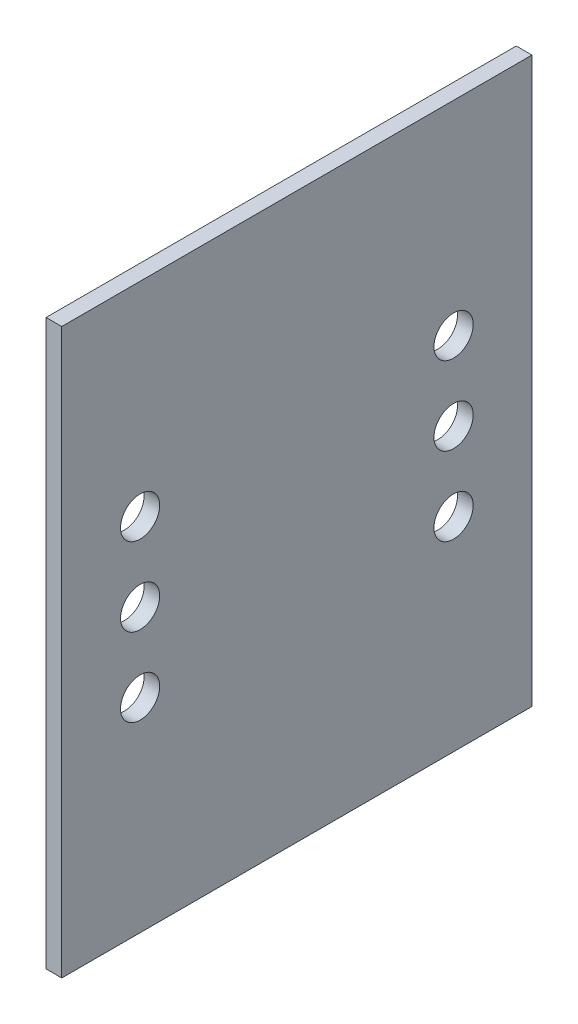
ISO-10303-21;
HEADER;
FILE_DESCRIPTION(('STEP AP214'),'2;1');
FILE_NAME('part.step','',(''),(''),'','','');
FILE_SCHEMA(('AUTOMOTIVE_DESIGN { 1 0 10303 214 1 1 1 1 }'));
ENDSEC;
DATA;
#1=APPLICATION_CONTEXT('core data for automotive mechanical design processes');
#2=APPLICATION_PROTOCOL_DEFINITION('international standard','automotive_design',2000,#1);
#3=PRODUCT_CONTEXT('',#1,'mechanical');
#4=PRODUCT('Part','Part','',(#3));
#5=PRODUCT_RELATED_PRODUCT_CATEGORY('part','',(#4));
#6=PRODUCT_DEFINITION_FORMATION('','',#4);
#7=PRODUCT_DEFINITION_CONTEXT('part definition',#1,'design');
#8=PRODUCT_DEFINITION('design','',#6,#7);
#9=PRODUCT_DEFINITION_SHAPE('','',#8);
#10=(LENGTH_UNIT() NAMED_UNIT(*) SI_UNIT(.MILLI.,.METRE.));
#11=(NAMED_UNIT(*) PLANE_ANGLE_UNIT() SI_UNIT($,.RADIAN.));
#12=(NAMED_UNIT(*) SI_UNIT($,.STERADIAN.) SOLID_ANGLE_UNIT());
#13=UNCERTAINTY_MEASURE_WITH_UNIT(LENGTH_MEASURE(1.E-05),#10,'distance_accuracy_value','');
#14=(GEOMETRIC_REPRESENTATION_CONTEXT(3) GLOBAL_UNCERTAINTY_ASSIGNED_CONTEXT((#13)) GLOBAL_UNIT_ASSIGNED_CONTEXT((#10,
#11,#12)) REPRESENTATION_CONTEXT('',''));
#15=CARTESIAN_POINT('',(0.,0.,0.));
#16=DIRECTION('',(0.,0.,1.));
#17=DIRECTION('',(1.,0.,0.));
#18=AXIS2_PLACEMENT_3D('',#15,#16,#17);
#19=CARTESIAN_POINT('',(160.,2387.5,30.));
#20=DIRECTION('',(1.,0.,0.));
#21=DIRECTION('',(0.,0.,-1.));
#22=AXIS2_PLACEMENT_3D('',#19,#20,#21);
#23=PLANE('',#22);
#24=DIRECTION('',(0.,1.,0.));
#25=VECTOR('',#24,1.);
#26=CARTESIAN_POINT('',(160.,2347.5,-150.));
#27=LINE('',#26,#25);
#28=CARTESIAN_POINT('',(160.,2347.5,-150.));
#29=VERTEX_POINT('',#28);
#30=CARTESIAN_POINT('',(160.,2707.5,-150.));
#31=VERTEX_POINT('',#30);
#32=EDGE_CURVE('E83',#29,#31,#27,.T.);
#33=ORIENTED_EDGE('',*,*,#32,.T.);
#34=DIRECTION('',(0.,0.,1.));
#35=VECTOR('',#34,1.);
#36=CARTESIAN_POINT('',(160.,2707.5,150.));
#37=LINE('',#36,#35);
#38=CARTESIAN_POINT('',(160.,2707.5,150.));
#39=VERTEX_POINT('',#38);
#40=EDGE_CURVE('E87',#31,#39,#37,.T.);
#41=ORIENTED_EDGE('',*,*,#40,.T.);
#42=DIRECTION('',(0.,-1.,0.));
#43=VECTOR('',#42,1.);
#44=CARTESIAN_POINT('',(160.,2347.5,150.));
#45=LINE('',#44,#43);
#46=CARTESIAN_POINT('',(160.,2347.5,150.));
#47=VERTEX_POINT('',#46);
#48=EDGE_CURVE('E77',#39,#47,#45,.T.);
#49=ORIENTED_EDGE('',*,*,#48,.T.);
#50=DIRECTION('',(0.,0.,-1.));
#51=VECTOR('',#50,1.);
#52=CARTESIAN_POINT('',(160.,2347.5,150.));
#53=LINE('',#52,#51);
#54=EDGE_CURVE('E38',#47,#29,#53,.T.);
#55=ORIENTED_EDGE('',*,*,#54,.T.);
#56=EDGE_LOOP('',(#33,#41,#49,#55));
#57=FACE_BOUND('',#56,.T.);
#58=CARTESIAN_POINT('',(160.,2577.5,100.));
#59=DIRECTION('',(1.,0.,0.));
#60=DIRECTION('',(0.,0.,-1.));
#61=AXIS2_PLACEMENT_3D('',#58,#59,#60);
#62=CIRCLE('',#61,12.5000000000002);
#63=CARTESIAN_POINT('',(160.,2577.5,87.4999999999998));
#64=VERTEX_POINT('',#63);
#65=EDGE_CURVE('E106',#64,#64,#62,.T.);
#66=ORIENTED_EDGE('',*,*,#65,.F.);
#67=EDGE_LOOP('',(#66));
#68=FACE_BOUND('',#67,.T.);
#69=CARTESIAN_POINT('',(160.,2527.5,100.));
#70=DIRECTION('',(1.,0.,0.));
#71=DIRECTION('',(0.,0.,-1.));
#72=AXIS2_PLACEMENT_3D('',#69,#70,#71);
#73=CIRCLE('',#72,12.5000000000002);
#74=CARTESIAN_POINT('',(160.,2527.5,87.4999999999998));
#75=VERTEX_POINT('',#74);
#76=EDGE_CURVE('E112',#75,#75,#73,.T.);
#77=ORIENTED_EDGE('',*,*,#76,.F.);
#78=EDGE_LOOP('',(#77));
#79=FACE_BOUND('',#78,.T.);
#80=CARTESIAN_POINT('',(160.,2477.5,100.));
#81=DIRECTION('',(1.,0.,0.));
#82=DIRECTION('',(0.,0.,-1.));
#83=AXIS2_PLACEMENT_3D('',#80,#81,#82);
#84=CIRCLE('',#83,12.5000000000002);
#85=CARTESIAN_POINT('',(160.,2477.5,87.4999999999998));
#86=VERTEX_POINT('',#85);
#87=EDGE_CURVE('E118',#86,#86,#84,.T.);
#88=ORIENTED_EDGE('',*,*,#87,.F.);
#89=EDGE_LOOP('',(#88));
#90=FACE_BOUND('',#89,.T.);
#91=CARTESIAN_POINT('',(160.,2577.5,-100.));
#92=DIRECTION('',(1.,0.,0.));
#93=DIRECTION('',(0.,0.,-1.));
#94=AXIS2_PLACEMENT_3D('',#91,#92,#93);
#95=CIRCLE('',#94,12.5000000000002);
#96=CARTESIAN_POINT('',(160.,2577.5,-112.5));
#97=VERTEX_POINT('',#96);
#98=EDGE_CURVE('E11',#97,#97,#95,.T.);
#99=ORIENTED_EDGE('',*,*,#98,.F.);
#100=EDGE_LOOP('',(#99));
#101=FACE_BOUND('',#100,.T.);
#102=CARTESIAN_POINT('',(160.,2527.5,-100.));
#103=DIRECTION('',(1.,0.,0.));
#104=DIRECTION('',(0.,0.,-1.));
#105=AXIS2_PLACEMENT_3D('',#102,#103,#104);
#106=CIRCLE('',#105,12.5000000000002);
#107=CARTESIAN_POINT('',(160.,2527.5,-112.5));
#108=VERTEX_POINT('',#107);
#109=EDGE_CURVE('E96',#108,#108,#106,.T.);
#110=ORIENTED_EDGE('',*,*,#109,.F.);
#111=EDGE_LOOP('',(#110));
#112=FACE_BOUND('',#111,.T.);
#113=CARTESIAN_POINT('',(160.,2477.5,-100.));
#114=DIRECTION('',(1.,0.,0.));
#115=DIRECTION('',(0.,0.,-1.));
#116=AXIS2_PLACEMENT_3D('',#113,#114,#115);
#117=CIRCLE('',#116,12.5000000000002);
#118=CARTESIAN_POINT('',(160.,2477.5,-112.5));
#119=VERTEX_POINT('',#118);
#120=EDGE_CURVE('E102',#119,#119,#117,.T.);
#121=ORIENTED_EDGE('',*,*,#120,.F.);
#122=EDGE_LOOP('',(#121));
#123=FACE_BOUND('',#122,.T.);
#124=ADVANCED_FACE('F34',(#57,#68,#79,#90,#101,#112,#123),#23,.T.);
#125=CARTESIAN_POINT('',(160.,2347.5,150.));
#126=DIRECTION('',(0.,1.,0.));
#127=DIRECTION('',(0.,0.,1.));
#128=AXIS2_PLACEMENT_3D('',#125,#126,#127);
#129=PLANE('',#128);
#130=ORIENTED_EDGE('',*,*,#54,.F.);
#131=DIRECTION('',(-1.,0.,0.));
#132=VECTOR('',#131,1.);
#133=CARTESIAN_POINT('',(160.,2347.5,150.));
#134=LINE('',#133,#132);
#135=CARTESIAN_POINT('',(150.,2347.5,150.));
#136=VERTEX_POINT('',#135);
#137=EDGE_CURVE('E78',#47,#136,#134,.T.);
#138=ORIENTED_EDGE('',*,*,#137,.T.);
#139=DIRECTION('',(0.,0.,-1.));
#140=VECTOR('',#139,1.);
#141=CARTESIAN_POINT('',(150.,2347.5,150.));
#142=LINE('',#141,#140);
#143=CARTESIAN_POINT('',(150.,2347.5,-150.));
#144=VERTEX_POINT('',#143);
#145=EDGE_CURVE('E125',#136,#144,#142,.T.);
#146=ORIENTED_EDGE('',*,*,#145,.T.);
#147=DIRECTION('',(-1.,0.,0.));
#148=VECTOR('',#147,1.);
#149=CARTESIAN_POINT('',(160.,2347.5,-150.));
#150=LINE('',#149,#148);
#151=EDGE_CURVE('E84',#29,#144,#150,.T.);
#152=ORIENTED_EDGE('',*,*,#151,.F.);
#153=EDGE_LOOP('',(#130,#138,#146,#152));
#154=FACE_BOUND('',#153,.T.);
#155=ADVANCED_FACE('F145',(#154),#129,.F.);
#156=CARTESIAN_POINT('',(150.,0.,0.));
#157=DIRECTION('',(-1.,0.,0.));
#158=DIRECTION('',(0.,0.,1.));
#159=AXIS2_PLACEMENT_3D('',#156,#157,#158);
#160=PLANE('',#159);
#161=CARTESIAN_POINT('',(150.,2577.5,-100.));
#162=DIRECTION('',(-1.,0.,0.));
#163=DIRECTION('',(0.,0.,1.));
#164=AXIS2_PLACEMENT_3D('',#161,#162,#163);
#165=CIRCLE('',#164,12.5000000000002);
#166=CARTESIAN_POINT('',(150.,2577.5,-87.4999999999998));
#167=VERTEX_POINT('',#166);
#168=EDGE_CURVE('E43',#167,#167,#165,.T.);
#169=ORIENTED_EDGE('',*,*,#168,.F.);
#170=EDGE_LOOP('',(#169));
#171=FACE_BOUND('',#170,.T.);
#172=CARTESIAN_POINT('',(150.,2527.5,-100.));
#173=DIRECTION('',(-1.,0.,0.));
#174=DIRECTION('',(0.,0.,1.));
#175=AXIS2_PLACEMENT_3D('',#172,#173,#174);
#176=CIRCLE('',#175,12.5000000000002);
#177=CARTESIAN_POINT('',(150.,2527.5,-87.4999999999998));
#178=VERTEX_POINT('',#177);
#179=EDGE_CURVE('E99',#178,#178,#176,.T.);
#180=ORIENTED_EDGE('',*,*,#179,.F.);
#181=EDGE_LOOP('',(#180));
#182=FACE_BOUND('',#181,.T.);
#183=CARTESIAN_POINT('',(150.,2477.5,-100.));
#184=DIRECTION('',(-1.,0.,0.));
#185=DIRECTION('',(0.,0.,1.));
#186=AXIS2_PLACEMENT_3D('',#183,#184,#185);
#187=CIRCLE('',#186,12.5000000000002);
#188=CARTESIAN_POINT('',(150.,2477.5,-87.4999999999998));
#189=VERTEX_POINT('',#188);
#190=EDGE_CURVE('E105',#189,#189,#187,.T.);
#191=ORIENTED_EDGE('',*,*,#190,.F.);
#192=EDGE_LOOP('',(#191));
#193=FACE_BOUND('',#192,.T.);
#194=CARTESIAN_POINT('',(150.,2577.5,100.));
#195=DIRECTION('',(-1.,0.,0.));
#196=DIRECTION('',(0.,0.,1.));
#197=AXIS2_PLACEMENT_3D('',#194,#195,#196);
#198=CIRCLE('',#197,12.5000000000002);
#199=CARTESIAN_POINT('',(150.,2577.5,112.5));
#200=VERTEX_POINT('',#199);
#201=EDGE_CURVE('E109',#200,#200,#198,.T.);
#202=ORIENTED_EDGE('',*,*,#201,.F.);
#203=EDGE_LOOP('',(#202));
#204=FACE_BOUND('',#203,.T.);
#205=CARTESIAN_POINT('',(150.,2527.5,100.));
#206=DIRECTION('',(-1.,0.,0.));
#207=DIRECTION('',(0.,0.,1.));
#208=AXIS2_PLACEMENT_3D('',#205,#206,#207);
#209=CIRCLE('',#208,12.5000000000002);
#210=CARTESIAN_POINT('',(150.,2527.5,112.5));
#211=VERTEX_POINT('',#210);
#212=EDGE_CURVE('E115',#211,#211,#209,.T.);
#213=ORIENTED_EDGE('',*,*,#212,.F.);
#214=EDGE_LOOP('',(#213));
#215=FACE_BOUND('',#214,.T.);
#216=CARTESIAN_POINT('',(150.,2477.5,100.));
#217=DIRECTION('',(-1.,0.,0.));
#218=DIRECTION('',(0.,0.,1.));
#219=AXIS2_PLACEMENT_3D('',#216,#217,#218);
#220=CIRCLE('',#219,12.5000000000002);
#221=CARTESIAN_POINT('',(150.,2477.5,112.5));
#222=VERTEX_POINT('',#221);
#223=EDGE_CURVE('E121',#222,#222,#220,.T.);
#224=ORIENTED_EDGE('',*,*,#223,.F.);
#225=EDGE_LOOP('',(#224));
#226=FACE_BOUND('',#225,.T.);
#227=DIRECTION('',(0.,1.,0.));
#228=VECTOR('',#227,1.);
#229=CARTESIAN_POINT('',(150.,2347.5,-150.));
#230=LINE('',#229,#228);
#231=CARTESIAN_POINT('',(150.,2707.5,-150.));
#232=VERTEX_POINT('',#231);
#233=EDGE_CURVE('E124',#144,#232,#230,.T.);
#234=ORIENTED_EDGE('',*,*,#233,.F.);
#235=ORIENTED_EDGE('',*,*,#145,.F.);
#236=DIRECTION('',(0.,-1.,0.));
#237=VECTOR('',#236,1.);
#238=CARTESIAN_POINT('',(150.,2347.5,150.));
#239=LINE('',#238,#237);
#240=CARTESIAN_POINT('',(150.,2707.5,150.));
#241=VERTEX_POINT('',#240);
#242=EDGE_CURVE('E130',#241,#136,#239,.T.);
#243=ORIENTED_EDGE('',*,*,#242,.F.);
#244=DIRECTION('',(0.,0.,1.));
#245=VECTOR('',#244,1.);
#246=CARTESIAN_POINT('',(150.,2707.5,150.));
#247=LINE('',#246,#245);
#248=EDGE_CURVE('E88',#232,#241,#247,.T.);
#249=ORIENTED_EDGE('',*,*,#248,.F.);
#250=EDGE_LOOP('',(#234,#235,#243,#249));
#251=FACE_BOUND('',#250,.T.);
#252=ADVANCED_FACE('F142',(#171,#182,#193,#204,#215,#226,#251),#160,.T.);
#253=CARTESIAN_POINT('',(160.,2707.5,150.));
#254=DIRECTION('',(0.,-1.,0.));
#255=DIRECTION('',(0.,0.,-1.));
#256=AXIS2_PLACEMENT_3D('',#253,#254,#255);
#257=PLANE('',#256);
#258=ORIENTED_EDGE('',*,*,#40,.F.);
#259=DIRECTION('',(-1.,0.,0.));
#260=VECTOR('',#259,1.);
#261=CARTESIAN_POINT('',(160.,2707.5,-150.));
#262=LINE('',#261,#260);
#263=EDGE_CURVE('E51',#31,#232,#262,.T.);
#264=ORIENTED_EDGE('',*,*,#263,.T.);
#265=ORIENTED_EDGE('',*,*,#248,.T.);
#266=DIRECTION('',(-1.,0.,0.));
#267=VECTOR('',#266,1.);
#268=CARTESIAN_POINT('',(160.,2707.5,150.));
#269=LINE('',#268,#267);
#270=EDGE_CURVE('E59',#39,#241,#269,.T.);
#271=ORIENTED_EDGE('',*,*,#270,.F.);
#272=EDGE_LOOP('',(#258,#264,#265,#271));
#273=FACE_BOUND('',#272,.T.);
#274=ADVANCED_FACE('F86',(#273),#257,.F.);
#275=CARTESIAN_POINT('',(160.,2347.5,150.));
#276=DIRECTION('',(0.,0.,-1.));
#277=DIRECTION('',(-1.,0.,0.));
#278=AXIS2_PLACEMENT_3D('',#275,#276,#277);
#279=PLANE('',#278);
#280=ORIENTED_EDGE('',*,*,#48,.F.);
#281=ORIENTED_EDGE('',*,*,#270,.T.);
#282=ORIENTED_EDGE('',*,*,#242,.T.);
#283=ORIENTED_EDGE('',*,*,#137,.F.);
#284=EDGE_LOOP('',(#280,#281,#282,#283));
#285=FACE_BOUND('',#284,.T.);
#286=ADVANCED_FACE('F36',(#285),#279,.F.);
#287=CARTESIAN_POINT('',(160.,2347.5,-150.));
#288=DIRECTION('',(0.,0.,1.));
#289=DIRECTION('',(1.,0.,0.));
#290=AXIS2_PLACEMENT_3D('',#287,#288,#289);
#291=PLANE('',#290);
#292=ORIENTED_EDGE('',*,*,#32,.F.);
#293=ORIENTED_EDGE('',*,*,#151,.T.);
#294=ORIENTED_EDGE('',*,*,#233,.T.);
#295=ORIENTED_EDGE('',*,*,#263,.F.);
#296=EDGE_LOOP('',(#292,#293,#294,#295));
#297=FACE_BOUND('',#296,.T.);
#298=ADVANCED_FACE('F160',(#297),#291,.F.);
#299=CARTESIAN_POINT('',(160.,2477.5,100.));
#300=DIRECTION('',(1.,0.,0.));
#301=DIRECTION('',(0.,0.,-1.));
#302=AXIS2_PLACEMENT_3D('',#299,#300,#301);
#303=CYLINDRICAL_SURFACE('',#302,12.5000000000002);
#304=ORIENTED_EDGE('',*,*,#223,.T.);
#305=EDGE_LOOP('',(#304));
#306=FACE_BOUND('',#305,.T.);
#307=ORIENTED_EDGE('',*,*,#87,.T.);
#308=EDGE_LOOP('',(#307));
#309=FACE_BOUND('',#308,.T.);
#310=ADVANCED_FACE('F174',(#306,#309),#303,.F.);
#311=CARTESIAN_POINT('',(160.,2527.5,100.));
#312=DIRECTION('',(1.,0.,0.));
#313=DIRECTION('',(0.,0.,-1.));
#314=AXIS2_PLACEMENT_3D('',#311,#312,#313);
#315=CYLINDRICAL_SURFACE('',#314,12.5000000000002);
#316=ORIENTED_EDGE('',*,*,#212,.T.);
#317=EDGE_LOOP('',(#316));
#318=FACE_BOUND('',#317,.T.);
#319=ORIENTED_EDGE('',*,*,#76,.T.);
#320=EDGE_LOOP('',(#319));
#321=FACE_BOUND('',#320,.T.);
#322=ADVANCED_FACE('F179',(#318,#321),#315,.F.);
#323=CARTESIAN_POINT('',(160.,2577.5,100.));
#324=DIRECTION('',(1.,0.,0.));
#325=DIRECTION('',(0.,0.,-1.));
#326=AXIS2_PLACEMENT_3D('',#323,#324,#325);
#327=CYLINDRICAL_SURFACE('',#326,12.5000000000002);
#328=ORIENTED_EDGE('',*,*,#201,.T.);
#329=EDGE_LOOP('',(#328));
#330=FACE_BOUND('',#329,.T.);
#331=ORIENTED_EDGE('',*,*,#65,.T.);
#332=EDGE_LOOP('',(#331));
#333=FACE_BOUND('',#332,.T.);
#334=ADVANCED_FACE('F231',(#330,#333),#327,.F.);
#335=CARTESIAN_POINT('',(160.,2477.5,-100.));
#336=DIRECTION('',(1.,0.,0.));
#337=DIRECTION('',(0.,0.,-1.));
#338=AXIS2_PLACEMENT_3D('',#335,#336,#337);
#339=CYLINDRICAL_SURFACE('',#338,12.5000000000002);
#340=ORIENTED_EDGE('',*,*,#190,.T.);
#341=EDGE_LOOP('',(#340));
#342=FACE_BOUND('',#341,.T.);
#343=ORIENTED_EDGE('',*,*,#120,.T.);
#344=EDGE_LOOP('',(#343));
#345=FACE_BOUND('',#344,.T.);
#346=ADVANCED_FACE('F240',(#342,#345),#339,.F.);
#347=CARTESIAN_POINT('',(160.,2527.5,-100.));
#348=DIRECTION('',(1.,0.,0.));
#349=DIRECTION('',(0.,0.,-1.));
#350=AXIS2_PLACEMENT_3D('',#347,#348,#349);
#351=CYLINDRICAL_SURFACE('',#350,12.5000000000002);
#352=ORIENTED_EDGE('',*,*,#179,.T.);
#353=EDGE_LOOP('',(#352));
#354=FACE_BOUND('',#353,.T.);
#355=ORIENTED_EDGE('',*,*,#109,.T.);
#356=EDGE_LOOP('',(#355));
#357=FACE_BOUND('',#356,.T.);
#358=ADVANCED_FACE('F249',(#354,#357),#351,.F.);
#359=CARTESIAN_POINT('',(160.,2577.5,-100.));
#360=DIRECTION('',(1.,0.,0.));
#361=DIRECTION('',(0.,0.,-1.));
#362=AXIS2_PLACEMENT_3D('',#359,#360,#361);
#363=CYLINDRICAL_SURFACE('',#362,12.5000000000002);
#364=ORIENTED_EDGE('',*,*,#168,.T.);
#365=EDGE_LOOP('',(#364));
#366=FACE_BOUND('',#365,.T.);
#367=ORIENTED_EDGE('',*,*,#98,.T.);
#368=EDGE_LOOP('',(#367));
#369=FACE_BOUND('',#368,.T.);
#370=ADVANCED_FACE('F139',(#366,#369),#363,.F.);
#371=CLOSED_SHELL('',(#124,#155,#252,#274,#286,#298,#310,#322,#334,#346,#358,#370));
#372=MANIFOLD_SOLID_BREP('B2',#371);
#373=ADVANCED_BREP_SHAPE_REPRESENTATION('',(#18,#372),#14);
#374=SHAPE_DEFINITION_REPRESENTATION(#9,#373);
ENDSEC;
END-ISO-10303-21;
